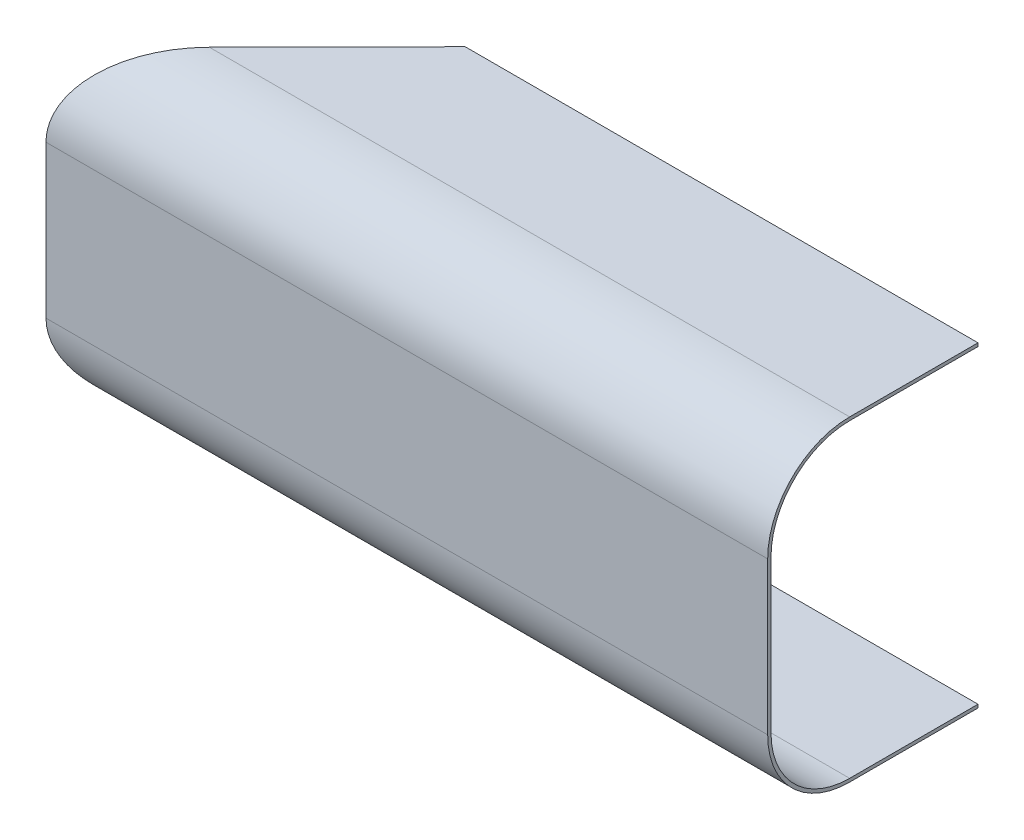
ISO-10303-21;
HEADER;
FILE_DESCRIPTION(('STEP AP214'),'2;1');
FILE_NAME('part.step','',(''),(''),'','','');
FILE_SCHEMA(('AUTOMOTIVE_DESIGN { 1 0 10303 214 1 1 1 1 }'));
ENDSEC;
DATA;
#1=APPLICATION_CONTEXT('core data for automotive mechanical design processes');
#2=APPLICATION_PROTOCOL_DEFINITION('international standard','automotive_design',2000,#1);
#3=PRODUCT_CONTEXT('',#1,'mechanical');
#4=PRODUCT('Part','Part','',(#3));
#5=PRODUCT_RELATED_PRODUCT_CATEGORY('part','',(#4));
#6=PRODUCT_DEFINITION_FORMATION('','',#4);
#7=PRODUCT_DEFINITION_CONTEXT('part definition',#1,'design');
#8=PRODUCT_DEFINITION('design','',#6,#7);
#9=PRODUCT_DEFINITION_SHAPE('','',#8);
#10=(LENGTH_UNIT() NAMED_UNIT(*) SI_UNIT(.MILLI.,.METRE.));
#11=(NAMED_UNIT(*) PLANE_ANGLE_UNIT() SI_UNIT($,.RADIAN.));
#12=(NAMED_UNIT(*) SI_UNIT($,.STERADIAN.) SOLID_ANGLE_UNIT());
#13=UNCERTAINTY_MEASURE_WITH_UNIT(LENGTH_MEASURE(1.E-05),#10,'distance_accuracy_value','');
#14=(GEOMETRIC_REPRESENTATION_CONTEXT(3) GLOBAL_UNCERTAINTY_ASSIGNED_CONTEXT((#13)) GLOBAL_UNIT_ASSIGNED_CONTEXT((#10,
#11,#12)) REPRESENTATION_CONTEXT('',''));
#15=CARTESIAN_POINT('',(0.,0.,0.));
#16=DIRECTION('',(0.,0.,1.));
#17=DIRECTION('',(1.,0.,0.));
#18=AXIS2_PLACEMENT_3D('',#15,#16,#17);
#19=CARTESIAN_POINT('',(-80.0100000000329,120.015,-43.5266689284502));
#20=DIRECTION('',(0.,0.,-1.));
#21=DIRECTION('',(-1.,0.,0.));
#22=AXIS2_PLACEMENT_3D('',#19,#20,#21);
#23=PLANE('',#22);
#24=DIRECTION('',(0.,-1.,0.));
#25=VECTOR('',#24,1.);
#26=CARTESIAN_POINT('',(0.210197293448816,196.85,-43.5266689284498));
#27=LINE('',#26,#25);
#28=CARTESIAN_POINT('',(0.210197293448816,120.015,-43.5266689284498));
#29=VERTEX_POINT('',#28);
#30=CARTESIAN_POINT('',(0.210197293448816,118.744999999999,-43.5266689284498));
#31=VERTEX_POINT('',#30);
#32=EDGE_CURVE('E120',#29,#31,#27,.T.);
#33=ORIENTED_EDGE('',*,*,#32,.F.);
#34=DIRECTION('',(1.,0.,0.));
#35=VECTOR('',#34,1.);
#36=CARTESIAN_POINT('',(-80.0100000000329,120.015,-43.5266689284502));
#37=LINE('',#36,#35);
#38=CARTESIAN_POINT('',(196.849999999967,120.015,-43.5266689284502));
#39=VERTEX_POINT('',#38);
#40=EDGE_CURVE('E126',#29,#39,#37,.T.);
#41=ORIENTED_EDGE('',*,*,#40,.T.);
#42=DIRECTION('',(0.,1.,0.));
#43=VECTOR('',#42,1.);
#44=CARTESIAN_POINT('',(196.849999999967,120.015,-43.5266689284502));
#45=LINE('',#44,#43);
#46=CARTESIAN_POINT('',(196.849999999967,118.744999999999,-43.5266689284502));
#47=VERTEX_POINT('',#46);
#48=EDGE_CURVE('E186',#47,#39,#45,.T.);
#49=ORIENTED_EDGE('',*,*,#48,.F.);
#50=DIRECTION('',(1.,0.,0.));
#51=VECTOR('',#50,1.);
#52=CARTESIAN_POINT('',(-80.0100000000329,118.744999999999,-43.5266689284502));
#53=LINE('',#52,#51);
#54=EDGE_CURVE('E40',#31,#47,#53,.T.);
#55=ORIENTED_EDGE('',*,*,#54,.F.);
#56=EDGE_LOOP('',(#33,#41,#49,#55));
#57=FACE_BOUND('',#56,.T.);
#58=ADVANCED_FACE('F33',(#57),#23,.T.);
#59=CARTESIAN_POINT('',(-80.0100000000329,118.744999999999,-43.5266689284502));
#60=DIRECTION('',(0.,-1.,0.));
#61=DIRECTION('',(0.,0.,-1.));
#62=AXIS2_PLACEMENT_3D('',#59,#60,#61);
#63=PLANE('',#62);
#64=DIRECTION('',(-0.70460604712508,0.,0.709598702334474));
#65=VECTOR('',#64,1.);
#66=CARTESIAN_POINT('',(-39.6166985183635,118.744999999999,-3.41757009033631));
#67=LINE('',#66,#65);
#68=CARTESIAN_POINT('',(-48.6560491921569,118.744999999999,5.68583107154926));
#69=VERTEX_POINT('',#68);
#70=EDGE_CURVE('E188',#31,#69,#67,.T.);
#71=ORIENTED_EDGE('',*,*,#70,.F.);
#72=ORIENTED_EDGE('',*,*,#54,.T.);
#73=DIRECTION('',(0.,0.,-1.));
#74=VECTOR('',#73,1.);
#75=CARTESIAN_POINT('',(196.849999999967,118.744999999999,-43.5266689284502));
#76=LINE('',#75,#74);
#77=CARTESIAN_POINT('',(196.849999999967,118.744999999999,5.68583107154926));
#78=VERTEX_POINT('',#77);
#79=EDGE_CURVE('E135',#78,#47,#76,.T.);
#80=ORIENTED_EDGE('',*,*,#79,.F.);
#81=DIRECTION('',(1.,0.,0.));
#82=VECTOR('',#81,1.);
#83=CARTESIAN_POINT('',(-80.0100000000329,118.744999999999,5.68583107154926));
#84=LINE('',#83,#82);
#85=EDGE_CURVE('E156',#69,#78,#84,.T.);
#86=ORIENTED_EDGE('',*,*,#85,.F.);
#87=EDGE_LOOP('',(#71,#72,#80,#86));
#88=FACE_BOUND('',#87,.T.);
#89=ADVANCED_FACE('F238',(#88),#63,.T.);
#90=CARTESIAN_POINT('',(-80.0100000000329,88.5824999999991,5.68583107154926));
#91=DIRECTION('',(1.,0.,0.));
#92=DIRECTION('',(0.,0.,-1.));
#93=AXIS2_PLACEMENT_3D('',#90,#91,#92);
#94=CYLINDRICAL_SURFACE('',#93,30.1624999999997);
#95=CARTESIAN_POINT('',(-48.6560491921569,88.5824999999991,5.68583107154926));
#96=DIRECTION('',(0.709598702334474,0.,0.70460604712508));
#97=DIRECTION('',(0.70460604712508,0.,-0.709598702334474));
#98=AXIS2_PLACEMENT_3D('',#95,#96,#97);
#99=ELLIPSE('',#98,42.5064193335889,30.1624999999997);
#100=CARTESIAN_POINT('',(-78.606329296238,88.5824999999991,35.8483310715489));
#101=VERTEX_POINT('',#100);
#102=EDGE_CURVE('E190',#69,#101,#99,.T.);
#103=ORIENTED_EDGE('',*,*,#102,.F.);
#104=ORIENTED_EDGE('',*,*,#85,.T.);
#105=CARTESIAN_POINT('',(196.849999999967,88.5824999999991,5.68583107154926));
#106=DIRECTION('',(-1.,0.,0.));
#107=DIRECTION('',(0.,0.,-1.));
#108=AXIS2_PLACEMENT_3D('',#105,#106,#107);
#109=CIRCLE('',#108,30.1624999999997);
#110=CARTESIAN_POINT('',(196.849999999967,88.5824999999991,35.848331071549));
#111=VERTEX_POINT('',#110);
#112=EDGE_CURVE('E138',#111,#78,#109,.T.);
#113=ORIENTED_EDGE('',*,*,#112,.F.);
#114=DIRECTION('',(1.,0.,0.));
#115=VECTOR('',#114,1.);
#116=CARTESIAN_POINT('',(-80.0100000000329,88.5824999999991,35.848331071549));
#117=LINE('',#116,#115);
#118=EDGE_CURVE('E154',#101,#111,#117,.T.);
#119=ORIENTED_EDGE('',*,*,#118,.F.);
#120=EDGE_LOOP('',(#103,#104,#113,#119));
#121=FACE_BOUND('',#120,.T.);
#122=ADVANCED_FACE('F236',(#121),#94,.F.);
#123=CARTESIAN_POINT('',(-80.0100000000329,88.5824999999991,35.8483310715489));
#124=DIRECTION('',(0.,0.,-1.));
#125=DIRECTION('',(0.,1.,0.));
#126=AXIS2_PLACEMENT_3D('',#123,#124,#125);
#127=PLANE('',#126);
#128=DIRECTION('',(0.,-1.,0.));
#129=VECTOR('',#128,1.);
#130=CARTESIAN_POINT('',(-78.606329296238,88.5824999999991,35.8483310715489));
#131=LINE('',#130,#129);
#132=CARTESIAN_POINT('',(-78.6063292962379,30.1624999999989,35.8483310715489));
#133=VERTEX_POINT('',#132);
#134=EDGE_CURVE('E192',#101,#133,#131,.T.);
#135=ORIENTED_EDGE('',*,*,#134,.F.);
#136=ORIENTED_EDGE('',*,*,#118,.T.);
#137=DIRECTION('',(0.,1.,0.));
#138=VECTOR('',#137,1.);
#139=CARTESIAN_POINT('',(196.849999999967,88.5824999999991,35.8483310715489));
#140=LINE('',#139,#138);
#141=CARTESIAN_POINT('',(196.849999999967,30.1624999999989,35.8483310715489));
#142=VERTEX_POINT('',#141);
#143=EDGE_CURVE('E161',#142,#111,#140,.T.);
#144=ORIENTED_EDGE('',*,*,#143,.F.);
#145=DIRECTION('',(1.,0.,0.));
#146=VECTOR('',#145,1.);
#147=CARTESIAN_POINT('',(-80.0100000000329,30.1624999999989,35.8483310715489));
#148=LINE('',#147,#146);
#149=EDGE_CURVE('E152',#133,#142,#148,.T.);
#150=ORIENTED_EDGE('',*,*,#149,.F.);
#151=EDGE_LOOP('',(#135,#136,#144,#150));
#152=FACE_BOUND('',#151,.T.);
#153=ADVANCED_FACE('F232',(#152),#127,.T.);
#154=CARTESIAN_POINT('',(-80.0100000000329,30.1624999999991,5.68583107154945));
#155=DIRECTION('',(1.,0.,0.));
#156=DIRECTION('',(0.,0.,-1.));
#157=AXIS2_PLACEMENT_3D('',#154,#155,#156);
#158=CYLINDRICAL_SURFACE('',#157,30.1624999999994);
#159=CARTESIAN_POINT('',(-48.6560491921571,30.1624999999991,5.68583107154945));
#160=DIRECTION('',(0.709598702334474,0.,0.70460604712508));
#161=DIRECTION('',(0.70460604712508,0.,-0.709598702334474));
#162=AXIS2_PLACEMENT_3D('',#159,#160,#161);
#163=ELLIPSE('',#162,42.5064193335885,30.1624999999994);
#164=CARTESIAN_POINT('',(-48.6560491921571,-3.08811677319048E-13,5.68583107154946));
#165=VERTEX_POINT('',#164);
#166=EDGE_CURVE('E194',#133,#165,#163,.T.);
#167=ORIENTED_EDGE('',*,*,#166,.F.);
#168=ORIENTED_EDGE('',*,*,#149,.T.);
#169=CARTESIAN_POINT('',(196.849999999967,30.1624999999991,5.68583107154945));
#170=DIRECTION('',(-1.,0.,0.));
#171=DIRECTION('',(0.,0.,-1.));
#172=AXIS2_PLACEMENT_3D('',#169,#170,#171);
#173=CIRCLE('',#172,30.1624999999994);
#174=CARTESIAN_POINT('',(196.849999999967,-3.01841884819964E-13,5.68583107154946));
#175=VERTEX_POINT('',#174);
#176=EDGE_CURVE('E164',#175,#142,#173,.T.);
#177=ORIENTED_EDGE('',*,*,#176,.F.);
#178=DIRECTION('',(1.,0.,0.));
#179=VECTOR('',#178,1.);
#180=CARTESIAN_POINT('',(-80.0100000000329,-3.01841884819964E-13,5.68583107154946));
#181=LINE('',#180,#179);
#182=EDGE_CURVE('E150',#165,#175,#181,.T.);
#183=ORIENTED_EDGE('',*,*,#182,.F.);
#184=EDGE_LOOP('',(#167,#168,#177,#183));
#185=FACE_BOUND('',#184,.T.);
#186=ADVANCED_FACE('F226',(#185),#158,.F.);
#187=CARTESIAN_POINT('',(-80.0100000000329,-3.08811677319048E-13,5.68583107154945));
#188=DIRECTION('',(0.,1.,0.));
#189=DIRECTION('',(0.,0.,1.));
#190=AXIS2_PLACEMENT_3D('',#187,#188,#189);
#191=PLANE('',#190);
#192=DIRECTION('',(0.70460604712508,0.,-0.709598702334474));
#193=VECTOR('',#192,1.);
#194=CARTESIAN_POINT('',(-64.2223351680634,-3.08811677319048E-13,21.3624157016976));
#195=LINE('',#194,#193);
#196=CARTESIAN_POINT('',(0.210197293448816,-3.05311331771918E-13,-43.5266689284498));
#197=VERTEX_POINT('',#196);
#198=EDGE_CURVE('E196',#165,#197,#195,.T.);
#199=ORIENTED_EDGE('',*,*,#198,.F.);
#200=ORIENTED_EDGE('',*,*,#182,.T.);
#201=DIRECTION('',(0.,0.,1.));
#202=VECTOR('',#201,1.);
#203=CARTESIAN_POINT('',(196.849999999967,-3.08811677319048E-13,5.68583107154945));
#204=LINE('',#203,#202);
#205=CARTESIAN_POINT('',(196.849999999967,-3.08811677319048E-13,-43.5266689284498));
#206=VERTEX_POINT('',#205);
#207=EDGE_CURVE('E167',#206,#175,#204,.T.);
#208=ORIENTED_EDGE('',*,*,#207,.F.);
#209=DIRECTION('',(1.,0.,0.));
#210=VECTOR('',#209,1.);
#211=CARTESIAN_POINT('',(-80.0100000000329,-3.08811677319048E-13,-43.5266689284498));
#212=LINE('',#211,#210);
#213=EDGE_CURVE('E148',#197,#206,#212,.T.);
#214=ORIENTED_EDGE('',*,*,#213,.F.);
#215=EDGE_LOOP('',(#199,#200,#208,#214));
#216=FACE_BOUND('',#215,.T.);
#217=ADVANCED_FACE('F222',(#216),#191,.T.);
#218=CARTESIAN_POINT('',(-80.0100000000329,-3.08811677319048E-13,-43.5266689284498));
#219=DIRECTION('',(0.,0.,-1.));
#220=DIRECTION('',(-1.,0.,0.));
#221=AXIS2_PLACEMENT_3D('',#218,#219,#220);
#222=PLANE('',#221);
#223=CARTESIAN_POINT('',(0.210197293448816,-1.26999999999977,-43.5266689284498));
#224=VERTEX_POINT('',#223);
#225=EDGE_CURVE('E128',#197,#224,#27,.T.);
#226=ORIENTED_EDGE('',*,*,#225,.F.);
#227=ORIENTED_EDGE('',*,*,#213,.T.);
#228=DIRECTION('',(0.,1.,0.));
#229=VECTOR('',#228,1.);
#230=CARTESIAN_POINT('',(196.849999999967,-3.08811677319048E-13,-43.5266689284498));
#231=LINE('',#230,#229);
#232=CARTESIAN_POINT('',(196.849999999967,-1.26999999999978,-43.5266689284498));
#233=VERTEX_POINT('',#232);
#234=EDGE_CURVE('E170',#233,#206,#231,.T.);
#235=ORIENTED_EDGE('',*,*,#234,.F.);
#236=DIRECTION('',(1.,0.,0.));
#237=VECTOR('',#236,1.);
#238=CARTESIAN_POINT('',(-80.0100000000329,-1.26999999999978,-43.5266689284498));
#239=LINE('',#238,#237);
#240=EDGE_CURVE('E146',#224,#233,#239,.T.);
#241=ORIENTED_EDGE('',*,*,#240,.F.);
#242=EDGE_LOOP('',(#226,#227,#235,#241));
#243=FACE_BOUND('',#242,.T.);
#244=ADVANCED_FACE('F216',(#243),#222,.T.);
#245=CARTESIAN_POINT('',(-80.0100000000329,-1.26999999999978,5.68583107154944));
#246=DIRECTION('',(0.,-1.,0.));
#247=DIRECTION('',(0.,0.,-1.));
#248=AXIS2_PLACEMENT_3D('',#245,#246,#247);
#249=PLANE('',#248);
#250=DIRECTION('',(-0.70460604712508,0.,0.709598702334474));
#251=VECTOR('',#250,1.);
#252=CARTESIAN_POINT('',(-64.2223351680634,-1.26999999999978,21.3624157016976));
#253=LINE('',#252,#251);
#254=CARTESIAN_POINT('',(-48.656049192157,-1.26999999999978,5.68583107154944));
#255=VERTEX_POINT('',#254);
#256=EDGE_CURVE('E198',#224,#255,#253,.T.);
#257=ORIENTED_EDGE('',*,*,#256,.F.);
#258=ORIENTED_EDGE('',*,*,#240,.T.);
#259=DIRECTION('',(0.,0.,-1.));
#260=VECTOR('',#259,1.);
#261=CARTESIAN_POINT('',(196.849999999967,-1.26999999999978,5.68583107154944));
#262=LINE('',#261,#260);
#263=CARTESIAN_POINT('',(196.849999999967,-1.26999999999978,5.68583107154944));
#264=VERTEX_POINT('',#263);
#265=EDGE_CURVE('E173',#264,#233,#262,.T.);
#266=ORIENTED_EDGE('',*,*,#265,.F.);
#267=DIRECTION('',(1.,0.,0.));
#268=VECTOR('',#267,1.);
#269=CARTESIAN_POINT('',(-80.0100000000329,-1.26999999999978,5.68583107154944));
#270=LINE('',#269,#268);
#271=EDGE_CURVE('E144',#255,#264,#270,.T.);
#272=ORIENTED_EDGE('',*,*,#271,.F.);
#273=EDGE_LOOP('',(#257,#258,#266,#272));
#274=FACE_BOUND('',#273,.T.);
#275=ADVANCED_FACE('F213',(#274),#249,.T.);
#276=CARTESIAN_POINT('',(-80.0100000000329,30.1624999999996,5.68583107154944));
#277=DIRECTION('',(1.,0.,0.));
#278=DIRECTION('',(0.,0.,-1.));
#279=AXIS2_PLACEMENT_3D('',#276,#277,#278);
#280=CYLINDRICAL_SURFACE('',#279,31.4324999999994);
#281=CARTESIAN_POINT('',(-48.656049192157,30.1624999999996,5.68583107154944));
#282=DIRECTION('',(0.709598702334474,0.,0.70460604712508));
#283=DIRECTION('',(0.70460604712508,0.,-0.709598702334474));
#284=AXIS2_PLACEMENT_3D('',#281,#282,#283);
#285=ELLIPSE('',#284,44.2961633055291,31.4324999999994);
#286=CARTESIAN_POINT('',(-79.867393721673,30.1624999999994,37.1183310715489));
#287=VERTEX_POINT('',#286);
#288=EDGE_CURVE('E200',#255,#287,#285,.F.);
#289=ORIENTED_EDGE('',*,*,#288,.F.);
#290=ORIENTED_EDGE('',*,*,#271,.T.);
#291=CARTESIAN_POINT('',(196.849999999967,30.1624999999996,5.68583107154944));
#292=DIRECTION('',(1.,0.,0.));
#293=DIRECTION('',(0.,0.,-1.));
#294=AXIS2_PLACEMENT_3D('',#291,#292,#293);
#295=CIRCLE('',#294,31.4324999999994);
#296=CARTESIAN_POINT('',(196.849999999967,30.1624999999994,37.1183310715489));
#297=VERTEX_POINT('',#296);
#298=EDGE_CURVE('E176',#297,#264,#295,.T.);
#299=ORIENTED_EDGE('',*,*,#298,.F.);
#300=DIRECTION('',(1.,0.,0.));
#301=VECTOR('',#300,1.);
#302=CARTESIAN_POINT('',(-80.0100000000329,30.1624999999994,37.1183310715489));
#303=LINE('',#302,#301);
#304=EDGE_CURVE('E142',#287,#297,#303,.T.);
#305=ORIENTED_EDGE('',*,*,#304,.F.);
#306=EDGE_LOOP('',(#289,#290,#299,#305));
#307=FACE_BOUND('',#306,.T.);
#308=ADVANCED_FACE('F259',(#307),#280,.T.);
#309=CARTESIAN_POINT('',(-80.0100000000329,88.5824999999996,37.1183310715489));
#310=DIRECTION('',(0.,0.,1.));
#311=DIRECTION('',(1.,0.,0.));
#312=AXIS2_PLACEMENT_3D('',#309,#310,#311);
#313=PLANE('',#312);
#314=DIRECTION('',(0.,1.,0.));
#315=VECTOR('',#314,1.);
#316=CARTESIAN_POINT('',(-79.867393721673,88.5824999999996,37.1183310715489));
#317=LINE('',#316,#315);
#318=CARTESIAN_POINT('',(-79.867393721673,88.5824999999996,37.1183310715489));
#319=VERTEX_POINT('',#318);
#320=EDGE_CURVE('E202',#287,#319,#317,.T.);
#321=ORIENTED_EDGE('',*,*,#320,.F.);
#322=ORIENTED_EDGE('',*,*,#304,.T.);
#323=DIRECTION('',(0.,-1.,0.));
#324=VECTOR('',#323,1.);
#325=CARTESIAN_POINT('',(196.849999999967,88.5824999999996,37.1183310715489));
#326=LINE('',#325,#324);
#327=CARTESIAN_POINT('',(196.849999999967,88.5824999999996,37.1183310715489));
#328=VERTEX_POINT('',#327);
#329=EDGE_CURVE('E179',#328,#297,#326,.T.);
#330=ORIENTED_EDGE('',*,*,#329,.F.);
#331=DIRECTION('',(1.,0.,0.));
#332=VECTOR('',#331,1.);
#333=CARTESIAN_POINT('',(-80.0100000000329,88.5824999999996,37.1183310715489));
#334=LINE('',#333,#332);
#335=EDGE_CURVE('E136',#319,#328,#334,.T.);
#336=ORIENTED_EDGE('',*,*,#335,.F.);
#337=EDGE_LOOP('',(#321,#322,#330,#336));
#338=FACE_BOUND('',#337,.T.);
#339=ADVANCED_FACE('F262',(#338),#313,.T.);
#340=CARTESIAN_POINT('',(-80.0100000000329,88.5824999999996,5.6858310715489));
#341=DIRECTION('',(1.,0.,0.));
#342=DIRECTION('',(0.,0.,-1.));
#343=AXIS2_PLACEMENT_3D('',#340,#341,#342);
#344=CYLINDRICAL_SURFACE('',#343,31.4325);
#345=CARTESIAN_POINT('',(-48.6560491921565,88.5824999999996,5.6858310715489));
#346=DIRECTION('',(0.709598702334474,0.,0.70460604712508));
#347=DIRECTION('',(0.70460604712508,0.,-0.709598702334474));
#348=AXIS2_PLACEMENT_3D('',#345,#346,#347);
#349=ELLIPSE('',#348,44.2961633055299,31.4325);
#350=CARTESIAN_POINT('',(-48.6560491921565,120.015,5.6858310715489));
#351=VERTEX_POINT('',#350);
#352=EDGE_CURVE('E46',#319,#351,#349,.F.);
#353=ORIENTED_EDGE('',*,*,#352,.F.);
#354=ORIENTED_EDGE('',*,*,#335,.T.);
#355=CARTESIAN_POINT('',(196.849999999967,88.5824999999996,5.6858310715489));
#356=DIRECTION('',(1.,0.,0.));
#357=DIRECTION('',(0.,0.,-1.));
#358=AXIS2_PLACEMENT_3D('',#355,#356,#357);
#359=CIRCLE('',#358,31.4325);
#360=CARTESIAN_POINT('',(196.849999999967,120.015,5.6858310715489));
#361=VERTEX_POINT('',#360);
#362=EDGE_CURVE('E182',#361,#328,#359,.T.);
#363=ORIENTED_EDGE('',*,*,#362,.F.);
#364=DIRECTION('',(1.,0.,0.));
#365=VECTOR('',#364,1.);
#366=CARTESIAN_POINT('',(-80.0100000000329,120.015,5.6858310715489));
#367=LINE('',#366,#365);
#368=EDGE_CURVE('E134',#351,#361,#367,.T.);
#369=ORIENTED_EDGE('',*,*,#368,.F.);
#370=EDGE_LOOP('',(#353,#354,#363,#369));
#371=FACE_BOUND('',#370,.T.);
#372=ADVANCED_FACE('F266',(#371),#344,.T.);
#373=CARTESIAN_POINT('',(-80.0100000000329,120.015,-43.5266689284502));
#374=DIRECTION('',(0.,1.,0.));
#375=DIRECTION('',(0.,0.,1.));
#376=AXIS2_PLACEMENT_3D('',#373,#374,#375);
#377=PLANE('',#376);
#378=DIRECTION('',(0.70460604712508,0.,-0.709598702334474));
#379=VECTOR('',#378,1.);
#380=CARTESIAN_POINT('',(-39.6166985183635,120.015,-3.41757009033631));
#381=LINE('',#380,#379);
#382=EDGE_CURVE('E11',#351,#29,#381,.T.);
#383=ORIENTED_EDGE('',*,*,#382,.F.);
#384=ORIENTED_EDGE('',*,*,#368,.T.);
#385=DIRECTION('',(0.,0.,1.));
#386=VECTOR('',#385,1.);
#387=CARTESIAN_POINT('',(196.849999999967,120.015,-43.5266689284502));
#388=LINE('',#387,#386);
#389=EDGE_CURVE('E132',#39,#361,#388,.T.);
#390=ORIENTED_EDGE('',*,*,#389,.F.);
#391=ORIENTED_EDGE('',*,*,#40,.F.);
#392=EDGE_LOOP('',(#383,#384,#390,#391));
#393=FACE_BOUND('',#392,.T.);
#394=ADVANCED_FACE('F130',(#393),#377,.T.);
#395=CARTESIAN_POINT('',(196.849999999967,88.5824999999991,5.68583107154926));
#396=DIRECTION('',(1.,0.,0.));
#397=DIRECTION('',(0.,0.,-1.));
#398=AXIS2_PLACEMENT_3D('',#395,#396,#397);
#399=PLANE('',#398);
#400=ORIENTED_EDGE('',*,*,#48,.T.);
#401=ORIENTED_EDGE('',*,*,#389,.T.);
#402=ORIENTED_EDGE('',*,*,#362,.T.);
#403=ORIENTED_EDGE('',*,*,#329,.T.);
#404=ORIENTED_EDGE('',*,*,#298,.T.);
#405=ORIENTED_EDGE('',*,*,#265,.T.);
#406=ORIENTED_EDGE('',*,*,#234,.T.);
#407=ORIENTED_EDGE('',*,*,#207,.T.);
#408=ORIENTED_EDGE('',*,*,#176,.T.);
#409=ORIENTED_EDGE('',*,*,#143,.T.);
#410=ORIENTED_EDGE('',*,*,#112,.T.);
#411=ORIENTED_EDGE('',*,*,#79,.T.);
#412=EDGE_LOOP('',(#400,#401,#402,#403,#404,#405,#406,#407,#408,#409,#410,#411));
#413=FACE_BOUND('',#412,.T.);
#414=ADVANCED_FACE('F219',(#413),#399,.T.);
#415=CARTESIAN_POINT('',(0.210197293448816,196.85,-43.5266689284498));
#416=DIRECTION('',(0.709598702334474,0.,0.70460604712508));
#417=DIRECTION('',(0.70460604712508,0.,-0.709598702334474));
#418=AXIS2_PLACEMENT_3D('',#415,#416,#417);
#419=PLANE('',#418);
#420=ORIENTED_EDGE('',*,*,#70,.T.);
#421=ORIENTED_EDGE('',*,*,#102,.T.);
#422=ORIENTED_EDGE('',*,*,#134,.T.);
#423=ORIENTED_EDGE('',*,*,#166,.T.);
#424=ORIENTED_EDGE('',*,*,#198,.T.);
#425=ORIENTED_EDGE('',*,*,#225,.T.);
#426=ORIENTED_EDGE('',*,*,#256,.T.);
#427=ORIENTED_EDGE('',*,*,#288,.T.);
#428=ORIENTED_EDGE('',*,*,#320,.T.);
#429=ORIENTED_EDGE('',*,*,#352,.T.);
#430=ORIENTED_EDGE('',*,*,#382,.T.);
#431=ORIENTED_EDGE('',*,*,#32,.T.);
#432=EDGE_LOOP('',(#420,#421,#422,#423,#424,#425,#426,#427,#428,#429,#430,#431));
#433=FACE_BOUND('',#432,.T.);
#434=ADVANCED_FACE('F119',(#433),#419,.F.);
#435=CLOSED_SHELL('',(#58,#89,#122,#153,#186,#217,#244,#275,#308,#339,#372,#394,#414,#434));
#436=MANIFOLD_SOLID_BREP('B2',#435);
#437=ADVANCED_BREP_SHAPE_REPRESENTATION('',(#18,#436),#14);
#438=SHAPE_DEFINITION_REPRESENTATION(#9,#437);
ENDSEC;
END-ISO-10303-21;
